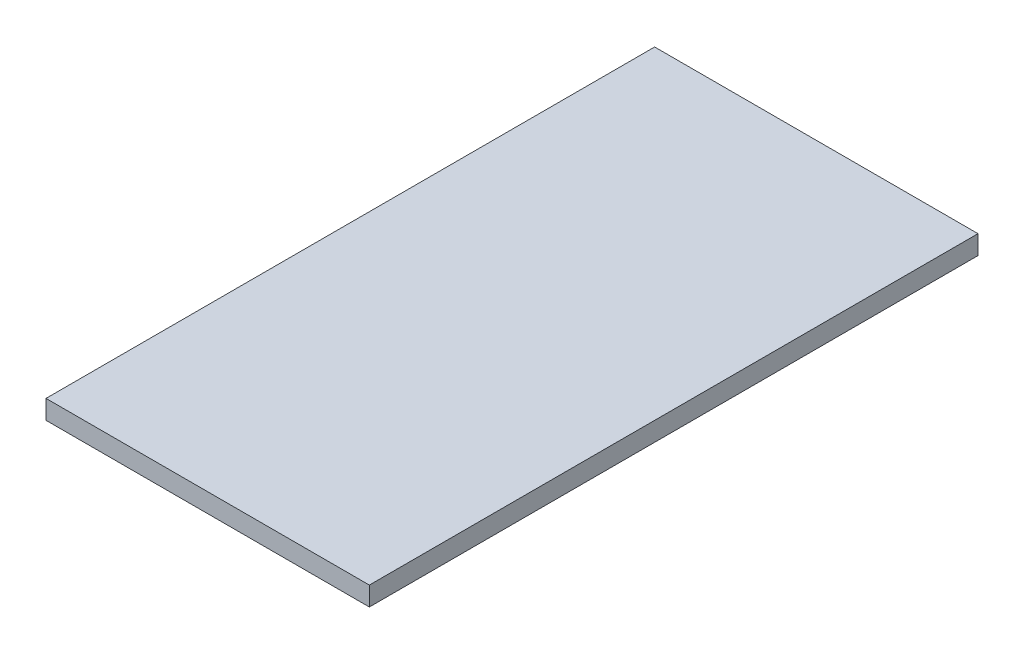
ISO-10303-21;
HEADER;
FILE_DESCRIPTION(('STEP AP214'),'2;1');
FILE_NAME('part.step','',(''),(''),'','','');
FILE_SCHEMA(('AUTOMOTIVE_DESIGN { 1 0 10303 214 1 1 1 1 }'));
ENDSEC;
DATA;
#1=APPLICATION_CONTEXT('core data for automotive mechanical design processes');
#2=APPLICATION_PROTOCOL_DEFINITION('international standard','automotive_design',2000,#1);
#3=PRODUCT_CONTEXT('',#1,'mechanical');
#4=PRODUCT('Part','Part','',(#3));
#5=PRODUCT_RELATED_PRODUCT_CATEGORY('part','',(#4));
#6=PRODUCT_DEFINITION_FORMATION('','',#4);
#7=PRODUCT_DEFINITION_CONTEXT('part definition',#1,'design');
#8=PRODUCT_DEFINITION('design','',#6,#7);
#9=PRODUCT_DEFINITION_SHAPE('','',#8);
#10=(LENGTH_UNIT() NAMED_UNIT(*) SI_UNIT(.MILLI.,.METRE.));
#11=(NAMED_UNIT(*) PLANE_ANGLE_UNIT() SI_UNIT($,.RADIAN.));
#12=(NAMED_UNIT(*) SI_UNIT($,.STERADIAN.) SOLID_ANGLE_UNIT());
#13=UNCERTAINTY_MEASURE_WITH_UNIT(LENGTH_MEASURE(1.E-05),#10,'distance_accuracy_value','');
#14=(GEOMETRIC_REPRESENTATION_CONTEXT(3) GLOBAL_UNCERTAINTY_ASSIGNED_CONTEXT((#13)) GLOBAL_UNIT_ASSIGNED_CONTEXT((#10,
#11,#12)) REPRESENTATION_CONTEXT('',''));
#15=CARTESIAN_POINT('',(0.,0.,0.));
#16=DIRECTION('',(0.,0.,1.));
#17=DIRECTION('',(1.,0.,0.));
#18=AXIS2_PLACEMENT_3D('',#15,#16,#17);
#19=CARTESIAN_POINT('',(-8.49999999999999,10.,-16.5));
#20=DIRECTION('',(1.,0.,0.));
#21=DIRECTION('',(0.,0.,-1.));
#22=AXIS2_PLACEMENT_3D('',#19,#20,#21);
#23=PLANE('',#22);
#24=DIRECTION('',(0.,0.,1.));
#25=VECTOR('',#24,1.);
#26=CARTESIAN_POINT('',(-8.49999999999999,9.,-16.5));
#27=LINE('',#26,#25);
#28=CARTESIAN_POINT('',(-8.49999999999999,9.,-16.5));
#29=VERTEX_POINT('',#28);
#30=CARTESIAN_POINT('',(-8.49999999999999,9.,15.5));
#31=VERTEX_POINT('',#30);
#32=EDGE_CURVE('E96',#29,#31,#27,.T.);
#33=ORIENTED_EDGE('',*,*,#32,.T.);
#34=DIRECTION('',(0.,-1.,0.));
#35=VECTOR('',#34,1.);
#36=CARTESIAN_POINT('',(-8.49999999999999,10.,15.5));
#37=LINE('',#36,#35);
#38=CARTESIAN_POINT('',(-8.49999999999999,10.,15.5));
#39=VERTEX_POINT('',#38);
#40=EDGE_CURVE('E11',#39,#31,#37,.T.);
#41=ORIENTED_EDGE('',*,*,#40,.F.);
#42=DIRECTION('',(0.,0.,1.));
#43=VECTOR('',#42,1.);
#44=CARTESIAN_POINT('',(-8.49999999999999,10.,-16.5));
#45=LINE('',#44,#43);
#46=CARTESIAN_POINT('',(-8.49999999999999,10.,-16.5));
#47=VERTEX_POINT('',#46);
#48=EDGE_CURVE('E84',#47,#39,#45,.T.);
#49=ORIENTED_EDGE('',*,*,#48,.F.);
#50=DIRECTION('',(0.,-1.,0.));
#51=VECTOR('',#50,1.);
#52=CARTESIAN_POINT('',(-8.49999999999999,10.,-16.5));
#53=LINE('',#52,#51);
#54=EDGE_CURVE('E92',#47,#29,#53,.T.);
#55=ORIENTED_EDGE('',*,*,#54,.T.);
#56=EDGE_LOOP('',(#33,#41,#49,#55));
#57=FACE_BOUND('',#56,.T.);
#58=ADVANCED_FACE('F33',(#57),#23,.F.);
#59=CARTESIAN_POINT('',(-8.49999999999999,10.,15.5));
#60=DIRECTION('',(0.,0.,-1.));
#61=DIRECTION('',(-1.,0.,0.));
#62=AXIS2_PLACEMENT_3D('',#59,#60,#61);
#63=PLANE('',#62);
#64=DIRECTION('',(1.,0.,0.));
#65=VECTOR('',#64,1.);
#66=CARTESIAN_POINT('',(-8.49999999999999,9.,15.5));
#67=LINE('',#66,#65);
#68=CARTESIAN_POINT('',(8.50000000000001,9.,15.5));
#69=VERTEX_POINT('',#68);
#70=EDGE_CURVE('E88',#31,#69,#67,.T.);
#71=ORIENTED_EDGE('',*,*,#70,.T.);
#72=DIRECTION('',(0.,-1.,0.));
#73=VECTOR('',#72,1.);
#74=CARTESIAN_POINT('',(8.50000000000001,10.,15.5));
#75=LINE('',#74,#73);
#76=CARTESIAN_POINT('',(8.50000000000001,10.,15.5));
#77=VERTEX_POINT('',#76);
#78=EDGE_CURVE('E41',#77,#69,#75,.T.);
#79=ORIENTED_EDGE('',*,*,#78,.F.);
#80=DIRECTION('',(1.,0.,0.));
#81=VECTOR('',#80,1.);
#82=CARTESIAN_POINT('',(-8.49999999999999,10.,15.5));
#83=LINE('',#82,#81);
#84=EDGE_CURVE('E79',#39,#77,#83,.T.);
#85=ORIENTED_EDGE('',*,*,#84,.F.);
#86=ORIENTED_EDGE('',*,*,#40,.T.);
#87=EDGE_LOOP('',(#71,#79,#85,#86));
#88=FACE_BOUND('',#87,.T.);
#89=ADVANCED_FACE('F87',(#88),#63,.F.);
#90=CARTESIAN_POINT('',(8.50000000000001,10.,-16.5));
#91=DIRECTION('',(-1.,0.,0.));
#92=DIRECTION('',(0.,0.,1.));
#93=AXIS2_PLACEMENT_3D('',#90,#91,#92);
#94=PLANE('',#93);
#95=DIRECTION('',(0.,0.,-1.));
#96=VECTOR('',#95,1.);
#97=CARTESIAN_POINT('',(8.50000000000001,9.,-16.5));
#98=LINE('',#97,#96);
#99=CARTESIAN_POINT('',(8.50000000000001,9.,-16.5));
#100=VERTEX_POINT('',#99);
#101=EDGE_CURVE('E66',#69,#100,#98,.T.);
#102=ORIENTED_EDGE('',*,*,#101,.T.);
#103=DIRECTION('',(0.,-1.,0.));
#104=VECTOR('',#103,1.);
#105=CARTESIAN_POINT('',(8.50000000000001,10.,-16.5));
#106=LINE('',#105,#104);
#107=CARTESIAN_POINT('',(8.50000000000001,10.,-16.5));
#108=VERTEX_POINT('',#107);
#109=EDGE_CURVE('E89',#108,#100,#106,.T.);
#110=ORIENTED_EDGE('',*,*,#109,.F.);
#111=DIRECTION('',(0.,0.,-1.));
#112=VECTOR('',#111,1.);
#113=CARTESIAN_POINT('',(8.50000000000001,10.,-16.5));
#114=LINE('',#113,#112);
#115=EDGE_CURVE('E82',#77,#108,#114,.T.);
#116=ORIENTED_EDGE('',*,*,#115,.F.);
#117=ORIENTED_EDGE('',*,*,#78,.T.);
#118=EDGE_LOOP('',(#102,#110,#116,#117));
#119=FACE_BOUND('',#118,.T.);
#120=ADVANCED_FACE('F90',(#119),#94,.F.);
#121=CARTESIAN_POINT('',(-8.49999999999999,10.,-16.5));
#122=DIRECTION('',(0.,0.,1.));
#123=DIRECTION('',(1.,0.,0.));
#124=AXIS2_PLACEMENT_3D('',#121,#122,#123);
#125=PLANE('',#124);
#126=DIRECTION('',(-1.,0.,0.));
#127=VECTOR('',#126,1.);
#128=CARTESIAN_POINT('',(-8.49999999999999,9.,-16.5));
#129=LINE('',#128,#127);
#130=EDGE_CURVE('E72',#100,#29,#129,.T.);
#131=ORIENTED_EDGE('',*,*,#130,.T.);
#132=ORIENTED_EDGE('',*,*,#54,.F.);
#133=DIRECTION('',(-1.,0.,0.));
#134=VECTOR('',#133,1.);
#135=CARTESIAN_POINT('',(-8.49999999999999,10.,-16.5));
#136=LINE('',#135,#134);
#137=EDGE_CURVE('E49',#108,#47,#136,.T.);
#138=ORIENTED_EDGE('',*,*,#137,.F.);
#139=ORIENTED_EDGE('',*,*,#109,.T.);
#140=EDGE_LOOP('',(#131,#132,#138,#139));
#141=FACE_BOUND('',#140,.T.);
#142=ADVANCED_FACE('F103',(#141),#125,.F.);
#143=CARTESIAN_POINT('',(0.,10.,0.));
#144=DIRECTION('',(0.,1.,0.));
#145=DIRECTION('',(0.,0.,1.));
#146=AXIS2_PLACEMENT_3D('',#143,#144,#145);
#147=PLANE('',#146);
#148=ORIENTED_EDGE('',*,*,#48,.T.);
#149=ORIENTED_EDGE('',*,*,#84,.T.);
#150=ORIENTED_EDGE('',*,*,#115,.T.);
#151=ORIENTED_EDGE('',*,*,#137,.T.);
#152=EDGE_LOOP('',(#148,#149,#150,#151));
#153=FACE_BOUND('',#152,.T.);
#154=ADVANCED_FACE('F80',(#153),#147,.T.);
#155=CARTESIAN_POINT('',(0.,9.,0.));
#156=DIRECTION('',(0.,1.,0.));
#157=DIRECTION('',(0.,0.,1.));
#158=AXIS2_PLACEMENT_3D('',#155,#156,#157);
#159=PLANE('',#158);
#160=ORIENTED_EDGE('',*,*,#32,.F.);
#161=ORIENTED_EDGE('',*,*,#130,.F.);
#162=ORIENTED_EDGE('',*,*,#101,.F.);
#163=ORIENTED_EDGE('',*,*,#70,.F.);
#164=EDGE_LOOP('',(#160,#161,#162,#163));
#165=FACE_BOUND('',#164,.T.);
#166=ADVANCED_FACE('F106',(#165),#159,.F.);
#167=CLOSED_SHELL('',(#58,#89,#120,#142,#154,#166));
#168=MANIFOLD_SOLID_BREP('B2',#167);
#169=ADVANCED_BREP_SHAPE_REPRESENTATION('',(#18,#168),#14);
#170=SHAPE_DEFINITION_REPRESENTATION(#9,#169);
ENDSEC;
END-ISO-10303-21;
